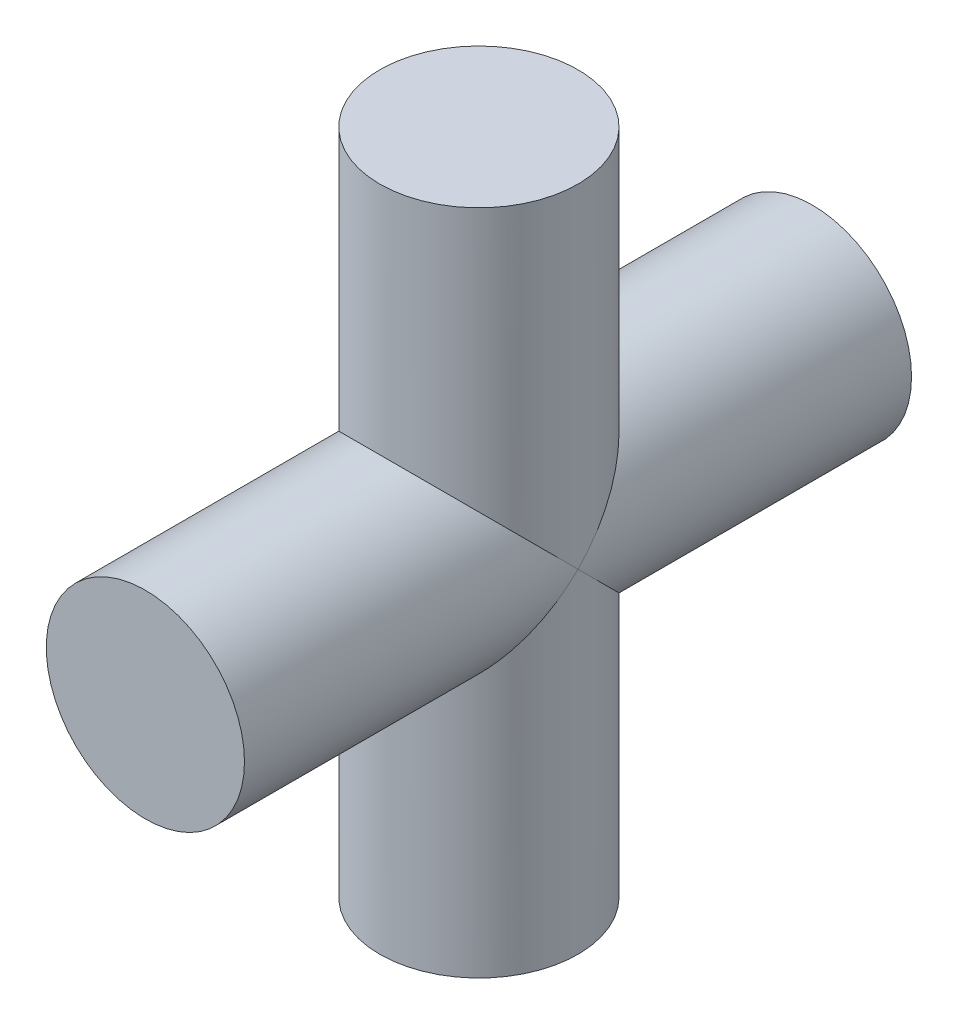
ISO-10303-21;
HEADER;
FILE_DESCRIPTION(('STEP AP214'),'2;1');
FILE_NAME('part.step','',(''),(''),'','','');
FILE_SCHEMA(('AUTOMOTIVE_DESIGN { 1 0 10303 214 1 1 1 1 }'));
ENDSEC;
DATA;
#1=APPLICATION_CONTEXT('core data for automotive mechanical design processes');
#2=APPLICATION_PROTOCOL_DEFINITION('international standard','automotive_design',2000,#1);
#3=PRODUCT_CONTEXT('',#1,'mechanical');
#4=PRODUCT('Part','Part','',(#3));
#5=PRODUCT_RELATED_PRODUCT_CATEGORY('part','',(#4));
#6=PRODUCT_DEFINITION_FORMATION('','',#4);
#7=PRODUCT_DEFINITION_CONTEXT('part definition',#1,'design');
#8=PRODUCT_DEFINITION('design','',#6,#7);
#9=PRODUCT_DEFINITION_SHAPE('','',#8);
#10=(LENGTH_UNIT() NAMED_UNIT(*) SI_UNIT(.MILLI.,.METRE.));
#11=(NAMED_UNIT(*) PLANE_ANGLE_UNIT() SI_UNIT($,.RADIAN.));
#12=(NAMED_UNIT(*) SI_UNIT($,.STERADIAN.) SOLID_ANGLE_UNIT());
#13=UNCERTAINTY_MEASURE_WITH_UNIT(LENGTH_MEASURE(1.E-05),#10,'distance_accuracy_value','');
#14=(GEOMETRIC_REPRESENTATION_CONTEXT(3) GLOBAL_UNCERTAINTY_ASSIGNED_CONTEXT((#13)) GLOBAL_UNIT_ASSIGNED_CONTEXT((#10,
#11,#12)) REPRESENTATION_CONTEXT('',''));
#15=CARTESIAN_POINT('',(0.,0.,0.));
#16=DIRECTION('',(0.,0.,1.));
#17=DIRECTION('',(1.,0.,0.));
#18=AXIS2_PLACEMENT_3D('',#15,#16,#17);
#19=CARTESIAN_POINT('',(0.,-26.924,0.));
#20=DIRECTION('',(0.,1.,0.));
#21=DIRECTION('',(0.,0.,1.));
#22=AXIS2_PLACEMENT_3D('',#19,#20,#21);
#23=CYLINDRICAL_SURFACE('',#22,8.);
#24=CARTESIAN_POINT('',(0.,0.,0.));
#25=DIRECTION('',(0.,0.707106781186547,0.707106781186547));
#26=DIRECTION('',(0.,0.707106781186547,-0.707106781186547));
#27=AXIS2_PLACEMENT_3D('',#24,#25,#26);
#28=ELLIPSE('',#27,11.3137084989848,8.);
#29=CARTESIAN_POINT('',(-8.,0.,0.));
#30=VERTEX_POINT('',#29);
#31=CARTESIAN_POINT('',(8.,0.,0.));
#32=VERTEX_POINT('',#31);
#33=EDGE_CURVE('E38',#30,#32,#28,.T.);
#34=ORIENTED_EDGE('',*,*,#33,.F.);
#35=CARTESIAN_POINT('',(0.,0.,0.));
#36=DIRECTION('',(0.,0.707106781186547,-0.707106781186547));
#37=DIRECTION('',(0.,0.707106781186547,0.707106781186547));
#38=AXIS2_PLACEMENT_3D('',#35,#36,#37);
#39=ELLIPSE('',#38,11.3137084989848,8.);
#40=EDGE_CURVE('E50',#32,#30,#39,.T.);
#41=ORIENTED_EDGE('',*,*,#40,.F.);
#42=EDGE_LOOP('',(#34,#41));
#43=FACE_BOUND('',#42,.T.);
#44=CARTESIAN_POINT('',(0.,-26.924,0.));
#45=DIRECTION('',(0.,1.,0.));
#46=DIRECTION('',(0.,0.,1.));
#47=AXIS2_PLACEMENT_3D('',#44,#45,#46);
#48=CIRCLE('',#47,8.);
#49=CARTESIAN_POINT('',(0.,-26.924,8.));
#50=VERTEX_POINT('',#49);
#51=EDGE_CURVE('E57',#50,#50,#48,.T.);
#52=ORIENTED_EDGE('',*,*,#51,.T.);
#53=EDGE_LOOP('',(#52));
#54=FACE_BOUND('',#53,.T.);
#55=ADVANCED_FACE('F31',(#43,#54),#23,.T.);
#56=CARTESIAN_POINT('',(0.,-26.924,0.));
#57=DIRECTION('',(0.,1.,0.));
#58=DIRECTION('',(0.,0.,1.));
#59=AXIS2_PLACEMENT_3D('',#56,#57,#58);
#60=PLANE('',#59);
#61=ORIENTED_EDGE('',*,*,#51,.F.);
#62=EDGE_LOOP('',(#61));
#63=FACE_BOUND('',#62,.T.);
#64=ADVANCED_FACE('F80',(#63),#60,.F.);
#65=CARTESIAN_POINT('',(0.,0.,26.924));
#66=DIRECTION('',(0.,0.,1.));
#67=DIRECTION('',(1.,0.,0.));
#68=AXIS2_PLACEMENT_3D('',#65,#66,#67);
#69=PLANE('',#68);
#70=CARTESIAN_POINT('',(0.,0.,26.924));
#71=DIRECTION('',(0.,0.,1.));
#72=DIRECTION('',(1.,0.,0.));
#73=AXIS2_PLACEMENT_3D('',#70,#71,#72);
#74=CIRCLE('',#73,8.);
#75=CARTESIAN_POINT('',(8.,0.,26.924));
#76=VERTEX_POINT('',#75);
#77=EDGE_CURVE('E70',#76,#76,#74,.T.);
#78=ORIENTED_EDGE('',*,*,#77,.T.);
#79=EDGE_LOOP('',(#78));
#80=FACE_BOUND('',#79,.T.);
#81=ADVANCED_FACE('F82',(#80),#69,.T.);
#82=CARTESIAN_POINT('',(0.,0.,-26.924));
#83=DIRECTION('',(0.,0.,1.));
#84=DIRECTION('',(1.,0.,0.));
#85=AXIS2_PLACEMENT_3D('',#82,#83,#84);
#86=CYLINDRICAL_SURFACE('',#85,8.);
#87=ORIENTED_EDGE('',*,*,#77,.F.);
#88=EDGE_LOOP('',(#87));
#89=FACE_BOUND('',#88,.T.);
#90=CARTESIAN_POINT('',(0.,0.,0.));
#91=DIRECTION('',(0.,0.707106781186547,-0.707106781186547));
#92=DIRECTION('',(0.,0.707106781186547,0.707106781186547));
#93=AXIS2_PLACEMENT_3D('',#90,#91,#92);
#94=ELLIPSE('',#93,11.3137084989848,8.);
#95=EDGE_CURVE('E44',#32,#30,#94,.F.);
#96=ORIENTED_EDGE('',*,*,#95,.T.);
#97=ORIENTED_EDGE('',*,*,#33,.T.);
#98=EDGE_LOOP('',(#96,#97));
#99=FACE_BOUND('',#98,.T.);
#100=ADVANCED_FACE('F59',(#89,#99),#86,.T.);
#101=CARTESIAN_POINT('',(0.,26.924,0.));
#102=DIRECTION('',(0.,1.,0.));
#103=DIRECTION('',(0.,0.,1.));
#104=AXIS2_PLACEMENT_3D('',#101,#102,#103);
#105=PLANE('',#104);
#106=CARTESIAN_POINT('',(0.,26.924,0.));
#107=DIRECTION('',(0.,1.,0.));
#108=DIRECTION('',(0.,0.,1.));
#109=AXIS2_PLACEMENT_3D('',#106,#107,#108);
#110=CIRCLE('',#109,8.);
#111=CARTESIAN_POINT('',(0.,26.924,8.));
#112=VERTEX_POINT('',#111);
#113=EDGE_CURVE('E69',#112,#112,#110,.T.);
#114=ORIENTED_EDGE('',*,*,#113,.T.);
#115=EDGE_LOOP('',(#114));
#116=FACE_BOUND('',#115,.T.);
#117=ADVANCED_FACE('F90',(#116),#105,.T.);
#118=CARTESIAN_POINT('',(0.,0.,0.));
#119=DIRECTION('',(0.,0.707106781186547,0.707106781186547));
#120=DIRECTION('',(0.,0.707106781186547,-0.707106781186547));
#121=AXIS2_PLACEMENT_3D('',#118,#119,#120);
#122=ELLIPSE('',#121,11.3137084989848,8.);
#123=EDGE_CURVE('E11',#30,#32,#122,.F.);
#124=ORIENTED_EDGE('',*,*,#123,.F.);
#125=ORIENTED_EDGE('',*,*,#95,.F.);
#126=EDGE_LOOP('',(#124,#125));
#127=FACE_BOUND('',#126,.T.);
#128=ORIENTED_EDGE('',*,*,#113,.F.);
#129=EDGE_LOOP('',(#128));
#130=FACE_BOUND('',#129,.T.);
#131=ADVANCED_FACE('F55',(#127,#130),#23,.T.);
#132=ORIENTED_EDGE('',*,*,#40,.T.);
#133=ORIENTED_EDGE('',*,*,#123,.T.);
#134=EDGE_LOOP('',(#132,#133));
#135=FACE_BOUND('',#134,.T.);
#136=CARTESIAN_POINT('',(0.,0.,-26.924));
#137=DIRECTION('',(0.,0.,1.));
#138=DIRECTION('',(1.,0.,0.));
#139=AXIS2_PLACEMENT_3D('',#136,#137,#138);
#140=CIRCLE('',#139,8.);
#141=CARTESIAN_POINT('',(8.,0.,-26.924));
#142=VERTEX_POINT('',#141);
#143=EDGE_CURVE('E67',#142,#142,#140,.T.);
#144=ORIENTED_EDGE('',*,*,#143,.T.);
#145=EDGE_LOOP('',(#144));
#146=FACE_BOUND('',#145,.T.);
#147=ADVANCED_FACE('F60',(#135,#146),#86,.T.);
#148=CARTESIAN_POINT('',(0.,0.,-26.924));
#149=DIRECTION('',(0.,0.,1.));
#150=DIRECTION('',(1.,0.,0.));
#151=AXIS2_PLACEMENT_3D('',#148,#149,#150);
#152=PLANE('',#151);
#153=ORIENTED_EDGE('',*,*,#143,.F.);
#154=EDGE_LOOP('',(#153));
#155=FACE_BOUND('',#154,.T.);
#156=ADVANCED_FACE('F63',(#155),#152,.F.);
#157=CLOSED_SHELL('',(#55,#64,#81,#100,#117,#131,#147,#156));
#158=MANIFOLD_SOLID_BREP('B2',#157);
#159=ADVANCED_BREP_SHAPE_REPRESENTATION('',(#18,#158),#14);
#160=SHAPE_DEFINITION_REPRESENTATION(#9,#159);
ENDSEC;
END-ISO-10303-21;
